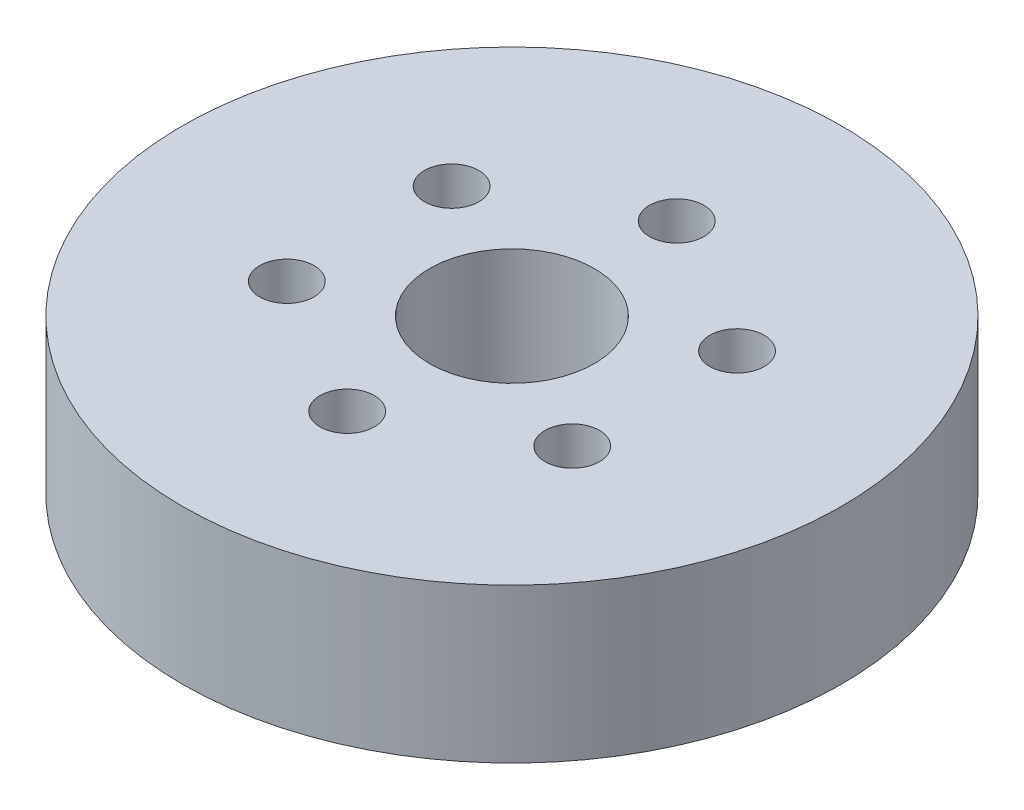
ISO-10303-21;
HEADER;
FILE_DESCRIPTION(('STEP AP214'),'2;1');
FILE_NAME('part.step','',(''),(''),'','','');
FILE_SCHEMA(('AUTOMOTIVE_DESIGN { 1 0 10303 214 1 1 1 1 }'));
ENDSEC;
DATA;
#1=APPLICATION_CONTEXT('core data for automotive mechanical design processes');
#2=APPLICATION_PROTOCOL_DEFINITION('international standard','automotive_design',2000,#1);
#3=PRODUCT_CONTEXT('',#1,'mechanical');
#4=PRODUCT('Part','Part','',(#3));
#5=PRODUCT_RELATED_PRODUCT_CATEGORY('part','',(#4));
#6=PRODUCT_DEFINITION_FORMATION('','',#4);
#7=PRODUCT_DEFINITION_CONTEXT('part definition',#1,'design');
#8=PRODUCT_DEFINITION('design','',#6,#7);
#9=PRODUCT_DEFINITION_SHAPE('','',#8);
#10=(LENGTH_UNIT() NAMED_UNIT(*) SI_UNIT(.MILLI.,.METRE.));
#11=(NAMED_UNIT(*) PLANE_ANGLE_UNIT() SI_UNIT($,.RADIAN.));
#12=(NAMED_UNIT(*) SI_UNIT($,.STERADIAN.) SOLID_ANGLE_UNIT());
#13=UNCERTAINTY_MEASURE_WITH_UNIT(LENGTH_MEASURE(1.E-05),#10,'distance_accuracy_value','');
#14=(GEOMETRIC_REPRESENTATION_CONTEXT(3) GLOBAL_UNCERTAINTY_ASSIGNED_CONTEXT((#13)) GLOBAL_UNIT_ASSIGNED_CONTEXT((#10,
#11,#12)) REPRESENTATION_CONTEXT('',''));
#15=CARTESIAN_POINT('',(0.,0.,0.));
#16=DIRECTION('',(0.,0.,1.));
#17=DIRECTION('',(1.,0.,0.));
#18=AXIS2_PLACEMENT_3D('',#15,#16,#17);
#19=CARTESIAN_POINT('',(0.,9.35,0.));
#20=DIRECTION('',(0.,1.,0.));
#21=DIRECTION('',(0.,0.,1.));
#22=AXIS2_PLACEMENT_3D('',#19,#20,#21);
#23=PLANE('',#22);
#24=CARTESIAN_POINT('',(0.,9.35,0.));
#25=DIRECTION('',(0.,1.,0.));
#26=DIRECTION('',(0.,0.,1.));
#27=AXIS2_PLACEMENT_3D('',#24,#25,#26);
#28=CIRCLE('',#27,5.);
#29=CARTESIAN_POINT('',(0.,9.35,5.));
#30=VERTEX_POINT('',#29);
#31=EDGE_CURVE('E54',#30,#30,#28,.T.);
#32=ORIENTED_EDGE('',*,*,#31,.F.);
#33=EDGE_LOOP('',(#32));
#34=FACE_BOUND('',#33,.T.);
#35=CARTESIAN_POINT('',(0.,9.35,0.));
#36=DIRECTION('',(0.,1.,0.));
#37=DIRECTION('',(0.,0.,1.));
#38=AXIS2_PLACEMENT_3D('',#35,#36,#37);
#39=CIRCLE('',#38,20.);
#40=CARTESIAN_POINT('',(0.,9.35,20.));
#41=VERTEX_POINT('',#40);
#42=EDGE_CURVE('E10',#41,#41,#39,.T.);
#43=ORIENTED_EDGE('',*,*,#42,.T.);
#44=EDGE_LOOP('',(#43));
#45=FACE_BOUND('',#44,.T.);
#46=CARTESIAN_POINT('',(-8.66025403784439,9.35,-4.99999999999999));
#47=DIRECTION('',(0.,-1.,0.));
#48=DIRECTION('',(0.,0.,-1.));
#49=AXIS2_PLACEMENT_3D('',#46,#47,#48);
#50=CIRCLE('',#49,1.65);
#51=CARTESIAN_POINT('',(-8.66025403784439,9.35,-6.64999999999999));
#52=VERTEX_POINT('',#51);
#53=EDGE_CURVE('E59',#52,#52,#50,.T.);
#54=ORIENTED_EDGE('',*,*,#53,.T.);
#55=EDGE_LOOP('',(#54));
#56=FACE_BOUND('',#55,.T.);
#57=CARTESIAN_POINT('',(0.,9.35,-10.));
#58=DIRECTION('',(0.,-1.,0.));
#59=DIRECTION('',(0.,0.,-1.));
#60=AXIS2_PLACEMENT_3D('',#57,#58,#59);
#61=CIRCLE('',#60,1.65);
#62=CARTESIAN_POINT('',(0.,9.35,-11.65));
#63=VERTEX_POINT('',#62);
#64=EDGE_CURVE('E67',#63,#63,#61,.T.);
#65=ORIENTED_EDGE('',*,*,#64,.T.);
#66=EDGE_LOOP('',(#65));
#67=FACE_BOUND('',#66,.T.);
#68=CARTESIAN_POINT('',(8.66025403784438,9.35,-4.99999999999999));
#69=DIRECTION('',(0.,-1.,0.));
#70=DIRECTION('',(0.,0.,-1.));
#71=AXIS2_PLACEMENT_3D('',#68,#69,#70);
#72=CIRCLE('',#71,1.65);
#73=CARTESIAN_POINT('',(8.66025403784438,9.35,-6.64999999999999));
#74=VERTEX_POINT('',#73);
#75=EDGE_CURVE('E73',#74,#74,#72,.T.);
#76=ORIENTED_EDGE('',*,*,#75,.T.);
#77=EDGE_LOOP('',(#76));
#78=FACE_BOUND('',#77,.T.);
#79=CARTESIAN_POINT('',(8.66025403784439,9.35,5.));
#80=DIRECTION('',(0.,-1.,0.));
#81=DIRECTION('',(0.,0.,-1.));
#82=AXIS2_PLACEMENT_3D('',#79,#80,#81);
#83=CIRCLE('',#82,1.65);
#84=CARTESIAN_POINT('',(8.66025403784439,9.35,3.35));
#85=VERTEX_POINT('',#84);
#86=EDGE_CURVE('E79',#85,#85,#83,.T.);
#87=ORIENTED_EDGE('',*,*,#86,.T.);
#88=EDGE_LOOP('',(#87));
#89=FACE_BOUND('',#88,.T.);
#90=CARTESIAN_POINT('',(0.,9.35,9.99999999999999));
#91=DIRECTION('',(0.,-1.,0.));
#92=DIRECTION('',(0.,0.,-1.));
#93=AXIS2_PLACEMENT_3D('',#90,#91,#92);
#94=CIRCLE('',#93,1.65);
#95=CARTESIAN_POINT('',(0.,9.35,8.35));
#96=VERTEX_POINT('',#95);
#97=EDGE_CURVE('E85',#96,#96,#94,.T.);
#98=ORIENTED_EDGE('',*,*,#97,.T.);
#99=EDGE_LOOP('',(#98));
#100=FACE_BOUND('',#99,.T.);
#101=CARTESIAN_POINT('',(-8.66025403784439,9.35,5.));
#102=DIRECTION('',(0.,-1.,0.));
#103=DIRECTION('',(0.,0.,-1.));
#104=AXIS2_PLACEMENT_3D('',#101,#102,#103);
#105=CIRCLE('',#104,1.65);
#106=CARTESIAN_POINT('',(-8.66025403784439,9.35,3.35000000000001));
#107=VERTEX_POINT('',#106);
#108=EDGE_CURVE('E91',#107,#107,#105,.T.);
#109=ORIENTED_EDGE('',*,*,#108,.T.);
#110=EDGE_LOOP('',(#109));
#111=FACE_BOUND('',#110,.T.);
#112=ADVANCED_FACE('F43',(#34,#45,#56,#67,#78,#89,#100,#111),#23,.T.);
#113=CARTESIAN_POINT('',(0.,0.,0.));
#114=DIRECTION('',(0.,1.,0.));
#115=DIRECTION('',(0.,0.,1.));
#116=AXIS2_PLACEMENT_3D('',#113,#114,#115);
#117=PLANE('',#116);
#118=CARTESIAN_POINT('',(-8.66025403784439,0.,5.));
#119=DIRECTION('',(0.,-1.,0.));
#120=DIRECTION('',(0.,0.,-1.));
#121=AXIS2_PLACEMENT_3D('',#118,#119,#120);
#122=CIRCLE('',#121,1.64999999999999);
#123=CARTESIAN_POINT('',(-8.66025403784439,0.,3.35000000000002));
#124=VERTEX_POINT('',#123);
#125=EDGE_CURVE('E94',#124,#124,#122,.T.);
#126=ORIENTED_EDGE('',*,*,#125,.F.);
#127=EDGE_LOOP('',(#126));
#128=FACE_BOUND('',#127,.T.);
#129=CARTESIAN_POINT('',(0.,0.,9.99999999999999));
#130=DIRECTION('',(0.,-1.,0.));
#131=DIRECTION('',(0.,0.,-1.));
#132=AXIS2_PLACEMENT_3D('',#129,#130,#131);
#133=CIRCLE('',#132,1.64999999999999);
#134=CARTESIAN_POINT('',(0.,0.,8.35000000000001));
#135=VERTEX_POINT('',#134);
#136=EDGE_CURVE('E88',#135,#135,#133,.T.);
#137=ORIENTED_EDGE('',*,*,#136,.F.);
#138=EDGE_LOOP('',(#137));
#139=FACE_BOUND('',#138,.T.);
#140=CARTESIAN_POINT('',(8.66025403784439,0.,5.));
#141=DIRECTION('',(0.,-1.,0.));
#142=DIRECTION('',(0.,0.,-1.));
#143=AXIS2_PLACEMENT_3D('',#140,#141,#142);
#144=CIRCLE('',#143,1.64999999999999);
#145=CARTESIAN_POINT('',(8.66025403784439,0.,3.35000000000001));
#146=VERTEX_POINT('',#145);
#147=EDGE_CURVE('E82',#146,#146,#144,.T.);
#148=ORIENTED_EDGE('',*,*,#147,.F.);
#149=EDGE_LOOP('',(#148));
#150=FACE_BOUND('',#149,.T.);
#151=CARTESIAN_POINT('',(8.66025403784438,0.,-4.99999999999999));
#152=DIRECTION('',(0.,-1.,0.));
#153=DIRECTION('',(0.,0.,-1.));
#154=AXIS2_PLACEMENT_3D('',#151,#152,#153);
#155=CIRCLE('',#154,1.64999999999999);
#156=CARTESIAN_POINT('',(8.66025403784438,0.,-6.64999999999998));
#157=VERTEX_POINT('',#156);
#158=EDGE_CURVE('E76',#157,#157,#155,.T.);
#159=ORIENTED_EDGE('',*,*,#158,.F.);
#160=EDGE_LOOP('',(#159));
#161=FACE_BOUND('',#160,.T.);
#162=CARTESIAN_POINT('',(0.,0.,-10.));
#163=DIRECTION('',(0.,-1.,0.));
#164=DIRECTION('',(0.,0.,-1.));
#165=AXIS2_PLACEMENT_3D('',#162,#163,#164);
#166=CIRCLE('',#165,1.64999999999999);
#167=CARTESIAN_POINT('',(0.,0.,-11.65));
#168=VERTEX_POINT('',#167);
#169=EDGE_CURVE('E70',#168,#168,#166,.T.);
#170=ORIENTED_EDGE('',*,*,#169,.F.);
#171=EDGE_LOOP('',(#170));
#172=FACE_BOUND('',#171,.T.);
#173=CARTESIAN_POINT('',(-8.66025403784439,0.,-4.99999999999999));
#174=DIRECTION('',(0.,-1.,0.));
#175=DIRECTION('',(0.,0.,-1.));
#176=AXIS2_PLACEMENT_3D('',#173,#174,#175);
#177=CIRCLE('',#176,1.64999999999999);
#178=CARTESIAN_POINT('',(-8.66025403784439,0.,-6.64999999999998));
#179=VERTEX_POINT('',#178);
#180=EDGE_CURVE('E64',#179,#179,#177,.T.);
#181=ORIENTED_EDGE('',*,*,#180,.F.);
#182=EDGE_LOOP('',(#181));
#183=FACE_BOUND('',#182,.T.);
#184=CARTESIAN_POINT('',(0.,0.,0.));
#185=DIRECTION('',(0.,1.,0.));
#186=DIRECTION('',(0.,0.,1.));
#187=AXIS2_PLACEMENT_3D('',#184,#185,#186);
#188=CIRCLE('',#187,20.);
#189=CARTESIAN_POINT('',(0.,0.,20.));
#190=VERTEX_POINT('',#189);
#191=EDGE_CURVE('E47',#190,#190,#188,.T.);
#192=ORIENTED_EDGE('',*,*,#191,.F.);
#193=EDGE_LOOP('',(#192));
#194=FACE_BOUND('',#193,.T.);
#195=CARTESIAN_POINT('',(0.,0.,0.));
#196=DIRECTION('',(0.,1.,0.));
#197=DIRECTION('',(0.,0.,1.));
#198=AXIS2_PLACEMENT_3D('',#195,#196,#197);
#199=CIRCLE('',#198,5.);
#200=CARTESIAN_POINT('',(0.,0.,5.));
#201=VERTEX_POINT('',#200);
#202=EDGE_CURVE('E56',#201,#201,#199,.T.);
#203=ORIENTED_EDGE('',*,*,#202,.T.);
#204=EDGE_LOOP('',(#203));
#205=FACE_BOUND('',#204,.T.);
#206=ADVANCED_FACE('F100',(#128,#139,#150,#161,#172,#183,#194,#205),#117,.F.);
#207=CARTESIAN_POINT('',(0.,9.35,0.));
#208=DIRECTION('',(0.,-1.,0.));
#209=DIRECTION('',(0.,0.,-1.));
#210=AXIS2_PLACEMENT_3D('',#207,#208,#209);
#211=CYLINDRICAL_SURFACE('',#210,20.);
#212=ORIENTED_EDGE('',*,*,#42,.F.);
#213=EDGE_LOOP('',(#212));
#214=FACE_BOUND('',#213,.T.);
#215=ORIENTED_EDGE('',*,*,#191,.T.);
#216=EDGE_LOOP('',(#215));
#217=FACE_BOUND('',#216,.T.);
#218=ADVANCED_FACE('F45',(#214,#217),#211,.T.);
#219=CARTESIAN_POINT('',(0.,9.35,0.));
#220=DIRECTION('',(0.,-1.,0.));
#221=DIRECTION('',(0.,0.,-1.));
#222=AXIS2_PLACEMENT_3D('',#219,#220,#221);
#223=CYLINDRICAL_SURFACE('',#222,5.);
#224=ORIENTED_EDGE('',*,*,#31,.T.);
#225=EDGE_LOOP('',(#224));
#226=FACE_BOUND('',#225,.T.);
#227=ORIENTED_EDGE('',*,*,#202,.F.);
#228=EDGE_LOOP('',(#227));
#229=FACE_BOUND('',#228,.T.);
#230=ADVANCED_FACE('F117',(#226,#229),#223,.F.);
#231=CARTESIAN_POINT('',(-8.66025403784439,0.,-4.99999999999999));
#232=DIRECTION('',(0.,-1.,0.));
#233=DIRECTION('',(0.,0.,-1.));
#234=AXIS2_PLACEMENT_3D('',#231,#232,#233);
#235=CYLINDRICAL_SURFACE('',#234,1.64999999999999);
#236=ORIENTED_EDGE('',*,*,#53,.F.);
#237=EDGE_LOOP('',(#236));
#238=FACE_BOUND('',#237,.T.);
#239=ORIENTED_EDGE('',*,*,#180,.T.);
#240=EDGE_LOOP('',(#239));
#241=FACE_BOUND('',#240,.T.);
#242=ADVANCED_FACE('F119',(#238,#241),#235,.F.);
#243=CARTESIAN_POINT('',(0.,0.,-10.));
#244=DIRECTION('',(0.,-1.,0.));
#245=DIRECTION('',(0.,0.,-1.));
#246=AXIS2_PLACEMENT_3D('',#243,#244,#245);
#247=CYLINDRICAL_SURFACE('',#246,1.64999999999999);
#248=ORIENTED_EDGE('',*,*,#64,.F.);
#249=EDGE_LOOP('',(#248));
#250=FACE_BOUND('',#249,.T.);
#251=ORIENTED_EDGE('',*,*,#169,.T.);
#252=EDGE_LOOP('',(#251));
#253=FACE_BOUND('',#252,.T.);
#254=ADVANCED_FACE('F127',(#250,#253),#247,.F.);
#255=CARTESIAN_POINT('',(8.66025403784438,0.,-4.99999999999999));
#256=DIRECTION('',(0.,-1.,0.));
#257=DIRECTION('',(0.,0.,-1.));
#258=AXIS2_PLACEMENT_3D('',#255,#256,#257);
#259=CYLINDRICAL_SURFACE('',#258,1.64999999999999);
#260=ORIENTED_EDGE('',*,*,#75,.F.);
#261=EDGE_LOOP('',(#260));
#262=FACE_BOUND('',#261,.T.);
#263=ORIENTED_EDGE('',*,*,#158,.T.);
#264=EDGE_LOOP('',(#263));
#265=FACE_BOUND('',#264,.T.);
#266=ADVANCED_FACE('F162',(#262,#265),#259,.F.);
#267=CARTESIAN_POINT('',(8.66025403784439,0.,5.));
#268=DIRECTION('',(0.,-1.,0.));
#269=DIRECTION('',(0.,0.,-1.));
#270=AXIS2_PLACEMENT_3D('',#267,#268,#269);
#271=CYLINDRICAL_SURFACE('',#270,1.64999999999999);
#272=ORIENTED_EDGE('',*,*,#86,.F.);
#273=EDGE_LOOP('',(#272));
#274=FACE_BOUND('',#273,.T.);
#275=ORIENTED_EDGE('',*,*,#147,.T.);
#276=EDGE_LOOP('',(#275));
#277=FACE_BOUND('',#276,.T.);
#278=ADVANCED_FACE('F156',(#274,#277),#271,.F.);
#279=CARTESIAN_POINT('',(0.,0.,9.99999999999999));
#280=DIRECTION('',(0.,-1.,0.));
#281=DIRECTION('',(0.,0.,-1.));
#282=AXIS2_PLACEMENT_3D('',#279,#280,#281);
#283=CYLINDRICAL_SURFACE('',#282,1.64999999999999);
#284=ORIENTED_EDGE('',*,*,#97,.F.);
#285=EDGE_LOOP('',(#284));
#286=FACE_BOUND('',#285,.T.);
#287=ORIENTED_EDGE('',*,*,#136,.T.);
#288=EDGE_LOOP('',(#287));
#289=FACE_BOUND('',#288,.T.);
#290=ADVANCED_FACE('F151',(#286,#289),#283,.F.);
#291=CARTESIAN_POINT('',(-8.66025403784439,0.,5.));
#292=DIRECTION('',(0.,-1.,0.));
#293=DIRECTION('',(0.,0.,-1.));
#294=AXIS2_PLACEMENT_3D('',#291,#292,#293);
#295=CYLINDRICAL_SURFACE('',#294,1.64999999999999);
#296=ORIENTED_EDGE('',*,*,#108,.F.);
#297=EDGE_LOOP('',(#296));
#298=FACE_BOUND('',#297,.T.);
#299=ORIENTED_EDGE('',*,*,#125,.T.);
#300=EDGE_LOOP('',(#299));
#301=FACE_BOUND('',#300,.T.);
#302=ADVANCED_FACE('F98',(#298,#301),#295,.F.);
#303=CLOSED_SHELL('',(#112,#206,#218,#230,#242,#254,#266,#278,#290,#302));
#304=MANIFOLD_SOLID_BREP('B2',#303);
#305=ADVANCED_BREP_SHAPE_REPRESENTATION('',(#18,#304),#14);
#306=SHAPE_DEFINITION_REPRESENTATION(#9,#305);
ENDSEC;
END-ISO-10303-21;
